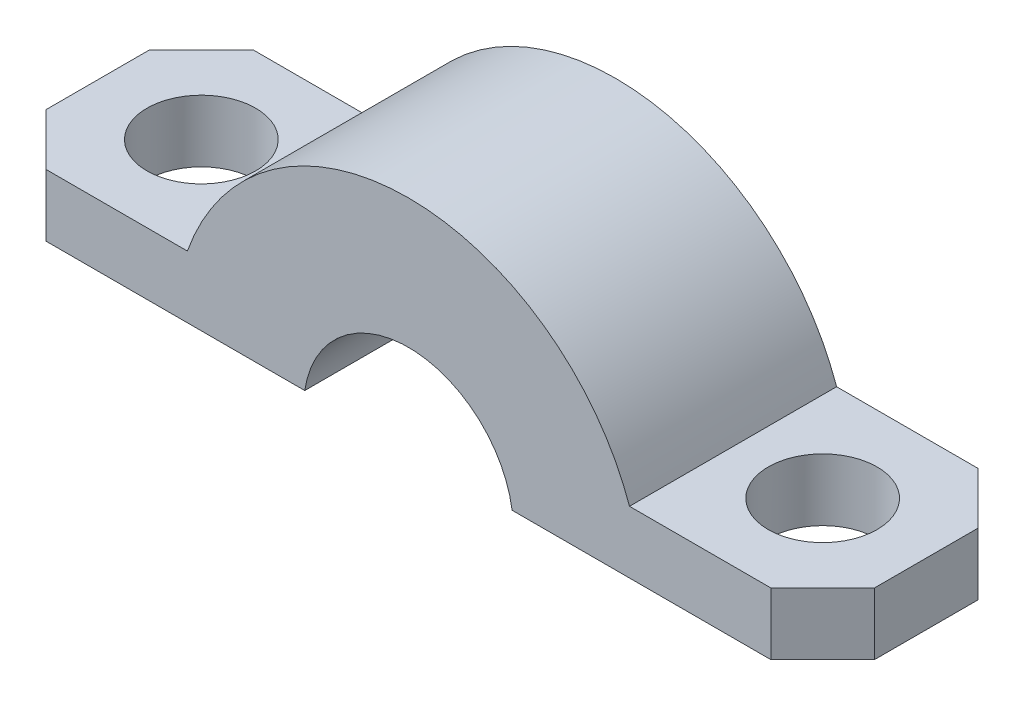
ISO-10303-21;
HEADER;
FILE_DESCRIPTION(('STEP AP214'),'2;1');
FILE_NAME('part.step','',(''),(''),'','','');
FILE_SCHEMA(('AUTOMOTIVE_DESIGN { 1 0 10303 214 1 1 1 1 }'));
ENDSEC;
DATA;
#1=APPLICATION_CONTEXT('core data for automotive mechanical design processes');
#2=APPLICATION_PROTOCOL_DEFINITION('international standard','automotive_design',2000,#1);
#3=PRODUCT_CONTEXT('',#1,'mechanical');
#4=PRODUCT('Part','Part','',(#3));
#5=PRODUCT_RELATED_PRODUCT_CATEGORY('part','',(#4));
#6=PRODUCT_DEFINITION_FORMATION('','',#4);
#7=PRODUCT_DEFINITION_CONTEXT('part definition',#1,'design');
#8=PRODUCT_DEFINITION('design','',#6,#7);
#9=PRODUCT_DEFINITION_SHAPE('','',#8);
#10=(LENGTH_UNIT() NAMED_UNIT(*) SI_UNIT(.MILLI.,.METRE.));
#11=(NAMED_UNIT(*) PLANE_ANGLE_UNIT() SI_UNIT($,.RADIAN.));
#12=(NAMED_UNIT(*) SI_UNIT($,.STERADIAN.) SOLID_ANGLE_UNIT());
#13=UNCERTAINTY_MEASURE_WITH_UNIT(LENGTH_MEASURE(1.E-05),#10,'distance_accuracy_value','');
#14=(GEOMETRIC_REPRESENTATION_CONTEXT(3) GLOBAL_UNCERTAINTY_ASSIGNED_CONTEXT((#13)) GLOBAL_UNIT_ASSIGNED_CONTEXT((#10,
#11,#12)) REPRESENTATION_CONTEXT('',''));
#15=CARTESIAN_POINT('',(0.,0.,0.));
#16=DIRECTION('',(0.,0.,1.));
#17=DIRECTION('',(1.,0.,0.));
#18=AXIS2_PLACEMENT_3D('',#15,#16,#17);
#19=CARTESIAN_POINT('',(0.,0.,4.));
#20=DIRECTION('',(0.,0.,-1.));
#21=DIRECTION('',(-1.,0.,0.));
#22=AXIS2_PLACEMENT_3D('',#19,#20,#21);
#23=CYLINDRICAL_SURFACE('',#22,4.05);
#24=CARTESIAN_POINT('',(0.,0.,-4.));
#25=DIRECTION('',(0.,0.,-1.));
#26=DIRECTION('',(-1.,0.,0.));
#27=AXIS2_PLACEMENT_3D('',#24,#25,#26);
#28=CIRCLE('',#27,4.05);
#29=CARTESIAN_POINT('',(-4.00530897684561,0.6,-4.));
#30=VERTEX_POINT('',#29);
#31=CARTESIAN_POINT('',(4.00530897684561,0.6,-4.));
#32=VERTEX_POINT('',#31);
#33=EDGE_CURVE('E160',#30,#32,#28,.T.);
#34=ORIENTED_EDGE('',*,*,#33,.T.);
#35=DIRECTION('',(0.,0.,-1.));
#36=VECTOR('',#35,1.);
#37=CARTESIAN_POINT('',(4.00530897684561,0.6,4.));
#38=LINE('',#37,#36);
#39=CARTESIAN_POINT('',(4.00530897684561,0.6,4.));
#40=VERTEX_POINT('',#39);
#41=EDGE_CURVE('E141',#32,#40,#38,.F.);
#42=ORIENTED_EDGE('',*,*,#41,.T.);
#43=CARTESIAN_POINT('',(0.,0.,4.));
#44=DIRECTION('',(0.,0.,-1.));
#45=DIRECTION('',(-1.,0.,0.));
#46=AXIS2_PLACEMENT_3D('',#43,#44,#45);
#47=CIRCLE('',#46,4.05);
#48=CARTESIAN_POINT('',(-4.00530897684561,0.6,4.));
#49=VERTEX_POINT('',#48);
#50=EDGE_CURVE('E158',#49,#40,#47,.T.);
#51=ORIENTED_EDGE('',*,*,#50,.F.);
#52=DIRECTION('',(0.,0.,-1.));
#53=VECTOR('',#52,1.);
#54=CARTESIAN_POINT('',(-4.00530897684561,0.6,4.));
#55=LINE('',#54,#53);
#56=EDGE_CURVE('E275',#49,#30,#55,.T.);
#57=ORIENTED_EDGE('',*,*,#56,.T.);
#58=EDGE_LOOP('',(#34,#42,#51,#57));
#59=FACE_BOUND('',#58,.T.);
#60=ADVANCED_FACE('F47',(#59),#23,.F.);
#61=CARTESIAN_POINT('',(16.,3.,4.));
#62=DIRECTION('',(-1.,0.,0.));
#63=DIRECTION('',(0.,0.,1.));
#64=AXIS2_PLACEMENT_3D('',#61,#62,#63);
#65=PLANE('',#64);
#66=DIRECTION('',(0.,0.,-1.));
#67=VECTOR('',#66,1.);
#68=CARTESIAN_POINT('',(16.,0.6,4.));
#69=LINE('',#68,#67);
#70=CARTESIAN_POINT('',(16.,0.6,1.99999999999999));
#71=VERTEX_POINT('',#70);
#72=CARTESIAN_POINT('',(16.,0.6,-2.));
#73=VERTEX_POINT('',#72);
#74=EDGE_CURVE('E162',#71,#73,#69,.T.);
#75=ORIENTED_EDGE('',*,*,#74,.T.);
#76=DIRECTION('',(0.,1.,0.));
#77=VECTOR('',#76,1.);
#78=CARTESIAN_POINT('',(16.,3.,-2.));
#79=LINE('',#78,#77);
#80=CARTESIAN_POINT('',(16.,3.,-2.));
#81=VERTEX_POINT('',#80);
#82=EDGE_CURVE('E222',#73,#81,#79,.T.);
#83=ORIENTED_EDGE('',*,*,#82,.T.);
#84=DIRECTION('',(0.,0.,-1.));
#85=VECTOR('',#84,1.);
#86=CARTESIAN_POINT('',(16.,3.,4.));
#87=LINE('',#86,#85);
#88=CARTESIAN_POINT('',(16.,3.,1.99999999999999));
#89=VERTEX_POINT('',#88);
#90=EDGE_CURVE('E207',#89,#81,#87,.T.);
#91=ORIENTED_EDGE('',*,*,#90,.F.);
#92=DIRECTION('',(0.,-1.,0.));
#93=VECTOR('',#92,1.);
#94=CARTESIAN_POINT('',(16.,3.,1.99999999999999));
#95=LINE('',#94,#93);
#96=EDGE_CURVE('E211',#89,#71,#95,.T.);
#97=ORIENTED_EDGE('',*,*,#96,.T.);
#98=EDGE_LOOP('',(#75,#83,#91,#97));
#99=FACE_BOUND('',#98,.T.);
#100=ADVANCED_FACE('F315',(#99),#65,.F.);
#101=CARTESIAN_POINT('',(8.53829608294301,3.,4.));
#102=DIRECTION('',(0.,-1.,0.));
#103=DIRECTION('',(1.,0.,0.));
#104=AXIS2_PLACEMENT_3D('',#101,#102,#103);
#105=PLANE('',#104);
#106=CARTESIAN_POINT('',(12.,3.,0.));
#107=DIRECTION('',(0.,-1.,0.));
#108=DIRECTION('',(1.,0.,0.));
#109=AXIS2_PLACEMENT_3D('',#106,#107,#108);
#110=CIRCLE('',#109,2.1);
#111=CARTESIAN_POINT('',(14.1,3.,0.));
#112=VERTEX_POINT('',#111);
#113=EDGE_CURVE('E192',#112,#112,#110,.F.);
#114=ORIENTED_EDGE('',*,*,#113,.F.);
#115=EDGE_LOOP('',(#114));
#116=FACE_BOUND('',#115,.T.);
#117=ORIENTED_EDGE('',*,*,#90,.T.);
#118=DIRECTION('',(-0.707106781186549,0.,-0.707106781186547));
#119=VECTOR('',#118,1.);
#120=CARTESIAN_POINT('',(16.,3.,-2.));
#121=LINE('',#120,#119);
#122=CARTESIAN_POINT('',(14.,3.,-4.));
#123=VERTEX_POINT('',#122);
#124=EDGE_CURVE('E229',#81,#123,#121,.T.);
#125=ORIENTED_EDGE('',*,*,#124,.T.);
#126=DIRECTION('',(-1.,0.,0.));
#127=VECTOR('',#126,1.);
#128=CARTESIAN_POINT('',(8.53829608294301,3.,-4.));
#129=LINE('',#128,#127);
#130=CARTESIAN_POINT('',(8.53829608294301,3.,-4.));
#131=VERTEX_POINT('',#130);
#132=EDGE_CURVE('E191',#123,#131,#129,.T.);
#133=ORIENTED_EDGE('',*,*,#132,.T.);
#134=DIRECTION('',(0.,0.,-1.));
#135=VECTOR('',#134,1.);
#136=CARTESIAN_POINT('',(8.53829608294301,3.,4.));
#137=LINE('',#136,#135);
#138=CARTESIAN_POINT('',(8.53829608294301,3.,4.));
#139=VERTEX_POINT('',#138);
#140=EDGE_CURVE('E203',#139,#131,#137,.T.);
#141=ORIENTED_EDGE('',*,*,#140,.F.);
#142=DIRECTION('',(-1.,0.,0.));
#143=VECTOR('',#142,1.);
#144=CARTESIAN_POINT('',(8.53829608294301,3.,4.));
#145=LINE('',#144,#143);
#146=CARTESIAN_POINT('',(14.,3.,4.));
#147=VERTEX_POINT('',#146);
#148=EDGE_CURVE('E169',#147,#139,#145,.T.);
#149=ORIENTED_EDGE('',*,*,#148,.F.);
#150=DIRECTION('',(-0.707106781186546,0.,0.707106781186549));
#151=VECTOR('',#150,1.);
#152=CARTESIAN_POINT('',(14.,3.,4.));
#153=LINE('',#152,#151);
#154=EDGE_CURVE('E226',#147,#89,#153,.F.);
#155=ORIENTED_EDGE('',*,*,#154,.T.);
#156=EDGE_LOOP('',(#117,#125,#133,#141,#149,#155));
#157=FACE_BOUND('',#156,.T.);
#158=ADVANCED_FACE('F311',(#116,#157),#105,.F.);
#159=CARTESIAN_POINT('',(0.,0.,4.));
#160=DIRECTION('',(0.,0.,-1.));
#161=DIRECTION('',(-1.,0.,0.));
#162=AXIS2_PLACEMENT_3D('',#159,#160,#161);
#163=CYLINDRICAL_SURFACE('',#162,9.05);
#164=CARTESIAN_POINT('',(0.,0.,-4.));
#165=DIRECTION('',(0.,0.,1.));
#166=DIRECTION('',(-1.,0.,0.));
#167=AXIS2_PLACEMENT_3D('',#164,#165,#166);
#168=CIRCLE('',#167,9.05);
#169=CARTESIAN_POINT('',(-8.53829608294301,3.,-4.));
#170=VERTEX_POINT('',#169);
#171=EDGE_CURVE('E176',#131,#170,#168,.T.);
#172=ORIENTED_EDGE('',*,*,#171,.T.);
#173=DIRECTION('',(0.,0.,-1.));
#174=VECTOR('',#173,1.);
#175=CARTESIAN_POINT('',(-8.53829608294301,3.,4.));
#176=LINE('',#175,#174);
#177=CARTESIAN_POINT('',(-8.53829608294301,3.,4.));
#178=VERTEX_POINT('',#177);
#179=EDGE_CURVE('E199',#178,#170,#176,.T.);
#180=ORIENTED_EDGE('',*,*,#179,.F.);
#181=CARTESIAN_POINT('',(0.,0.,4.));
#182=DIRECTION('',(0.,0.,1.));
#183=DIRECTION('',(-1.,0.,0.));
#184=AXIS2_PLACEMENT_3D('',#181,#182,#183);
#185=CIRCLE('',#184,9.05);
#186=EDGE_CURVE('E174',#139,#178,#185,.T.);
#187=ORIENTED_EDGE('',*,*,#186,.F.);
#188=ORIENTED_EDGE('',*,*,#140,.T.);
#189=EDGE_LOOP('',(#172,#180,#187,#188));
#190=FACE_BOUND('',#189,.T.);
#191=ADVANCED_FACE('F303',(#190),#163,.T.);
#192=CARTESIAN_POINT('',(-16.,3.,4.));
#193=DIRECTION('',(0.,-1.,0.));
#194=DIRECTION('',(1.,0.,0.));
#195=AXIS2_PLACEMENT_3D('',#192,#193,#194);
#196=PLANE('',#195);
#197=CARTESIAN_POINT('',(-12.,3.,0.));
#198=DIRECTION('',(0.,-1.,0.));
#199=DIRECTION('',(1.,0.,0.));
#200=AXIS2_PLACEMENT_3D('',#197,#198,#199);
#201=CIRCLE('',#200,2.1);
#202=CARTESIAN_POINT('',(-9.9,3.,0.));
#203=VERTEX_POINT('',#202);
#204=EDGE_CURVE('E179',#203,#203,#201,.F.);
#205=ORIENTED_EDGE('',*,*,#204,.F.);
#206=EDGE_LOOP('',(#205));
#207=FACE_BOUND('',#206,.T.);
#208=DIRECTION('',(-1.,0.,0.));
#209=VECTOR('',#208,1.);
#210=CARTESIAN_POINT('',(-16.,3.,-4.));
#211=LINE('',#210,#209);
#212=CARTESIAN_POINT('',(-14.,3.,-4.));
#213=VERTEX_POINT('',#212);
#214=EDGE_CURVE('E170',#170,#213,#211,.T.);
#215=ORIENTED_EDGE('',*,*,#214,.T.);
#216=DIRECTION('',(-0.707106781186549,0.,0.707106781186547));
#217=VECTOR('',#216,1.);
#218=CARTESIAN_POINT('',(-16.,3.,-2.));
#219=LINE('',#218,#217);
#220=CARTESIAN_POINT('',(-16.,3.,-2.));
#221=VERTEX_POINT('',#220);
#222=EDGE_CURVE('E11',#213,#221,#219,.T.);
#223=ORIENTED_EDGE('',*,*,#222,.T.);
#224=DIRECTION('',(0.,0.,-1.));
#225=VECTOR('',#224,1.);
#226=CARTESIAN_POINT('',(-16.,3.,4.));
#227=LINE('',#226,#225);
#228=CARTESIAN_POINT('',(-16.,3.,1.99999999999999));
#229=VERTEX_POINT('',#228);
#230=EDGE_CURVE('E188',#229,#221,#227,.T.);
#231=ORIENTED_EDGE('',*,*,#230,.F.);
#232=DIRECTION('',(-0.707106781186546,0.,-0.707106781186549));
#233=VECTOR('',#232,1.);
#234=CARTESIAN_POINT('',(-14.,3.,4.));
#235=LINE('',#234,#233);
#236=CARTESIAN_POINT('',(-14.,3.,4.));
#237=VERTEX_POINT('',#236);
#238=EDGE_CURVE('E57',#229,#237,#235,.F.);
#239=ORIENTED_EDGE('',*,*,#238,.T.);
#240=DIRECTION('',(-1.,0.,0.));
#241=VECTOR('',#240,1.);
#242=CARTESIAN_POINT('',(-16.,3.,4.));
#243=LINE('',#242,#241);
#244=EDGE_CURVE('E184',#178,#237,#243,.T.);
#245=ORIENTED_EDGE('',*,*,#244,.F.);
#246=ORIENTED_EDGE('',*,*,#179,.T.);
#247=EDGE_LOOP('',(#215,#223,#231,#239,#245,#246));
#248=FACE_BOUND('',#247,.T.);
#249=ADVANCED_FACE('F263',(#207,#248),#196,.F.);
#250=CARTESIAN_POINT('',(-16.,0.,4.));
#251=DIRECTION('',(1.,0.,0.));
#252=DIRECTION('',(0.,0.,-1.));
#253=AXIS2_PLACEMENT_3D('',#250,#251,#252);
#254=PLANE('',#253);
#255=ORIENTED_EDGE('',*,*,#230,.T.);
#256=DIRECTION('',(0.,-1.,0.));
#257=VECTOR('',#256,1.);
#258=CARTESIAN_POINT('',(-16.,0.6,-2.));
#259=LINE('',#258,#257);
#260=CARTESIAN_POINT('',(-16.,0.6,-2.));
#261=VERTEX_POINT('',#260);
#262=EDGE_CURVE('E251',#221,#261,#259,.T.);
#263=ORIENTED_EDGE('',*,*,#262,.T.);
#264=DIRECTION('',(0.,0.,1.));
#265=VECTOR('',#264,1.);
#266=CARTESIAN_POINT('',(-16.,0.6,4.));
#267=LINE('',#266,#265);
#268=CARTESIAN_POINT('',(-16.,0.6,1.99999999999999));
#269=VERTEX_POINT('',#268);
#270=EDGE_CURVE('E271',#261,#269,#267,.T.);
#271=ORIENTED_EDGE('',*,*,#270,.T.);
#272=DIRECTION('',(0.,1.,0.));
#273=VECTOR('',#272,1.);
#274=CARTESIAN_POINT('',(-16.,0.,1.99999999999999));
#275=LINE('',#274,#273);
#276=EDGE_CURVE('E69',#269,#229,#275,.T.);
#277=ORIENTED_EDGE('',*,*,#276,.T.);
#278=EDGE_LOOP('',(#255,#263,#271,#277));
#279=FACE_BOUND('',#278,.T.);
#280=ADVANCED_FACE('F272',(#279),#254,.F.);
#281=CARTESIAN_POINT('',(0.,0.,4.));
#282=DIRECTION('',(0.,0.,-1.));
#283=DIRECTION('',(-1.,0.,0.));
#284=AXIS2_PLACEMENT_3D('',#281,#282,#283);
#285=PLANE('',#284);
#286=DIRECTION('',(1.,0.,0.));
#287=VECTOR('',#286,1.);
#288=CARTESIAN_POINT('',(0.,0.6,4.));
#289=LINE('',#288,#287);
#290=CARTESIAN_POINT('',(14.,0.6,4.));
#291=VERTEX_POINT('',#290);
#292=EDGE_CURVE('E137',#40,#291,#289,.T.);
#293=ORIENTED_EDGE('',*,*,#292,.T.);
#294=DIRECTION('',(0.,1.,0.));
#295=VECTOR('',#294,1.);
#296=CARTESIAN_POINT('',(14.,0.,4.));
#297=LINE('',#296,#295);
#298=EDGE_CURVE('E246',#291,#147,#297,.T.);
#299=ORIENTED_EDGE('',*,*,#298,.T.);
#300=ORIENTED_EDGE('',*,*,#148,.T.);
#301=ORIENTED_EDGE('',*,*,#186,.T.);
#302=ORIENTED_EDGE('',*,*,#244,.T.);
#303=DIRECTION('',(0.,-1.,0.));
#304=VECTOR('',#303,1.);
#305=CARTESIAN_POINT('',(-14.,0.,4.));
#306=LINE('',#305,#304);
#307=CARTESIAN_POINT('',(-14.,0.6,4.));
#308=VERTEX_POINT('',#307);
#309=EDGE_CURVE('E243',#237,#308,#306,.T.);
#310=ORIENTED_EDGE('',*,*,#309,.T.);
#311=EDGE_CURVE('E153',#308,#49,#289,.T.);
#312=ORIENTED_EDGE('',*,*,#311,.T.);
#313=ORIENTED_EDGE('',*,*,#50,.T.);
#314=EDGE_LOOP('',(#293,#299,#300,#301,#302,#310,#312,#313));
#315=FACE_BOUND('',#314,.T.);
#316=ADVANCED_FACE('F164',(#315),#285,.F.);
#317=CARTESIAN_POINT('',(0.,0.,-4.));
#318=DIRECTION('',(0.,0.,-1.));
#319=DIRECTION('',(-1.,0.,0.));
#320=AXIS2_PLACEMENT_3D('',#317,#318,#319);
#321=PLANE('',#320);
#322=ORIENTED_EDGE('',*,*,#132,.F.);
#323=DIRECTION('',(0.,-1.,0.));
#324=VECTOR('',#323,1.);
#325=CARTESIAN_POINT('',(14.,0.6,-4.));
#326=LINE('',#325,#324);
#327=CARTESIAN_POINT('',(14.,0.6,-4.));
#328=VERTEX_POINT('',#327);
#329=EDGE_CURVE('E235',#123,#328,#326,.T.);
#330=ORIENTED_EDGE('',*,*,#329,.T.);
#331=DIRECTION('',(1.,0.,0.));
#332=VECTOR('',#331,1.);
#333=CARTESIAN_POINT('',(0.,0.6,-4.));
#334=LINE('',#333,#332);
#335=EDGE_CURVE('E280',#32,#328,#334,.T.);
#336=ORIENTED_EDGE('',*,*,#335,.F.);
#337=ORIENTED_EDGE('',*,*,#33,.F.);
#338=CARTESIAN_POINT('',(-14.,0.6,-4.));
#339=VERTEX_POINT('',#338);
#340=EDGE_CURVE('E151',#339,#30,#334,.T.);
#341=ORIENTED_EDGE('',*,*,#340,.F.);
#342=DIRECTION('',(0.,1.,0.));
#343=VECTOR('',#342,1.);
#344=CARTESIAN_POINT('',(-14.,3.,-4.));
#345=LINE('',#344,#343);
#346=EDGE_CURVE('E232',#339,#213,#345,.T.);
#347=ORIENTED_EDGE('',*,*,#346,.T.);
#348=ORIENTED_EDGE('',*,*,#214,.F.);
#349=ORIENTED_EDGE('',*,*,#171,.F.);
#350=EDGE_LOOP('',(#322,#330,#336,#337,#341,#347,#348,#349));
#351=FACE_BOUND('',#350,.T.);
#352=ADVANCED_FACE('F295',(#351),#321,.T.);
#353=CARTESIAN_POINT('',(-12.,9.05,0.));
#354=DIRECTION('',(0.,-1.,0.));
#355=DIRECTION('',(0.,0.,-1.));
#356=AXIS2_PLACEMENT_3D('',#353,#354,#355);
#357=CYLINDRICAL_SURFACE('',#356,2.1);
#358=CARTESIAN_POINT('',(-12.,0.6,0.));
#359=DIRECTION('',(0.,1.,0.));
#360=DIRECTION('',(0.,0.,1.));
#361=AXIS2_PLACEMENT_3D('',#358,#359,#360);
#362=CIRCLE('',#361,2.1);
#363=CARTESIAN_POINT('',(-12.,0.6,2.1));
#364=VERTEX_POINT('',#363);
#365=EDGE_CURVE('E219',#364,#364,#362,.T.);
#366=ORIENTED_EDGE('',*,*,#365,.F.);
#367=EDGE_LOOP('',(#366));
#368=FACE_BOUND('',#367,.T.);
#369=ORIENTED_EDGE('',*,*,#204,.T.);
#370=EDGE_LOOP('',(#369));
#371=FACE_BOUND('',#370,.T.);
#372=ADVANCED_FACE('F291',(#368,#371),#357,.F.);
#373=CARTESIAN_POINT('',(12.,9.05,0.));
#374=DIRECTION('',(0.,-1.,0.));
#375=DIRECTION('',(0.,0.,-1.));
#376=AXIS2_PLACEMENT_3D('',#373,#374,#375);
#377=CYLINDRICAL_SURFACE('',#376,2.1);
#378=CARTESIAN_POINT('',(12.,0.6,0.));
#379=DIRECTION('',(0.,1.,0.));
#380=DIRECTION('',(0.,0.,1.));
#381=AXIS2_PLACEMENT_3D('',#378,#379,#380);
#382=CIRCLE('',#381,2.1);
#383=CARTESIAN_POINT('',(12.,0.6,2.1));
#384=VERTEX_POINT('',#383);
#385=EDGE_CURVE('E215',#384,#384,#382,.T.);
#386=ORIENTED_EDGE('',*,*,#385,.F.);
#387=EDGE_LOOP('',(#386));
#388=FACE_BOUND('',#387,.T.);
#389=ORIENTED_EDGE('',*,*,#113,.T.);
#390=EDGE_LOOP('',(#389));
#391=FACE_BOUND('',#390,.T.);
#392=ADVANCED_FACE('F294',(#388,#391),#377,.F.);
#393=CARTESIAN_POINT('',(0.,0.6,0.));
#394=DIRECTION('',(0.,1.,0.));
#395=DIRECTION('',(0.,0.,1.));
#396=AXIS2_PLACEMENT_3D('',#393,#394,#395);
#397=PLANE('',#396);
#398=ORIENTED_EDGE('',*,*,#385,.T.);
#399=EDGE_LOOP('',(#398));
#400=FACE_BOUND('',#399,.T.);
#401=ORIENTED_EDGE('',*,*,#335,.T.);
#402=DIRECTION('',(0.707106781186549,0.,0.707106781186547));
#403=VECTOR('',#402,1.);
#404=CARTESIAN_POINT('',(16.,0.6,-2.));
#405=LINE('',#404,#403);
#406=EDGE_CURVE('E240',#328,#73,#405,.T.);
#407=ORIENTED_EDGE('',*,*,#406,.T.);
#408=ORIENTED_EDGE('',*,*,#74,.F.);
#409=DIRECTION('',(0.707106781186546,0.,-0.707106781186549));
#410=VECTOR('',#409,1.);
#411=CARTESIAN_POINT('',(14.,0.6,4.));
#412=LINE('',#411,#410);
#413=EDGE_CURVE('E145',#71,#291,#412,.F.);
#414=ORIENTED_EDGE('',*,*,#413,.T.);
#415=ORIENTED_EDGE('',*,*,#292,.F.);
#416=ORIENTED_EDGE('',*,*,#41,.F.);
#417=EDGE_LOOP('',(#401,#407,#408,#414,#415,#416));
#418=FACE_BOUND('',#417,.T.);
#419=ADVANCED_FACE('F140',(#400,#418),#397,.F.);
#420=ORIENTED_EDGE('',*,*,#365,.T.);
#421=EDGE_LOOP('',(#420));
#422=FACE_BOUND('',#421,.T.);
#423=ORIENTED_EDGE('',*,*,#270,.F.);
#424=DIRECTION('',(0.707106781186549,0.,-0.707106781186547));
#425=VECTOR('',#424,1.);
#426=CARTESIAN_POINT('',(-16.,0.6,-2.));
#427=LINE('',#426,#425);
#428=EDGE_CURVE('E258',#261,#339,#427,.T.);
#429=ORIENTED_EDGE('',*,*,#428,.T.);
#430=ORIENTED_EDGE('',*,*,#340,.T.);
#431=ORIENTED_EDGE('',*,*,#56,.F.);
#432=ORIENTED_EDGE('',*,*,#311,.F.);
#433=DIRECTION('',(0.707106781186546,0.,0.707106781186549));
#434=VECTOR('',#433,1.);
#435=CARTESIAN_POINT('',(-14.,0.6,4.));
#436=LINE('',#435,#434);
#437=EDGE_CURVE('E255',#308,#269,#436,.F.);
#438=ORIENTED_EDGE('',*,*,#437,.T.);
#439=EDGE_LOOP('',(#423,#429,#430,#431,#432,#438));
#440=FACE_BOUND('',#439,.T.);
#441=ADVANCED_FACE('F270',(#422,#440),#397,.F.);
#442=CARTESIAN_POINT('',(16.,3.,-2.));
#443=DIRECTION('',(0.707106781186547,0.,-0.707106781186549));
#444=DIRECTION('',(0.,-1.,0.));
#445=AXIS2_PLACEMENT_3D('',#442,#443,#444);
#446=PLANE('',#445);
#447=ORIENTED_EDGE('',*,*,#406,.F.);
#448=ORIENTED_EDGE('',*,*,#329,.F.);
#449=ORIENTED_EDGE('',*,*,#124,.F.);
#450=ORIENTED_EDGE('',*,*,#82,.F.);
#451=EDGE_LOOP('',(#447,#448,#449,#450));
#452=FACE_BOUND('',#451,.T.);
#453=ADVANCED_FACE('F325',(#452),#446,.T.);
#454=CARTESIAN_POINT('',(14.,0.,4.));
#455=DIRECTION('',(-0.707106781186549,0.,-0.707106781186546));
#456=DIRECTION('',(0.,1.,0.));
#457=AXIS2_PLACEMENT_3D('',#454,#455,#456);
#458=PLANE('',#457);
#459=ORIENTED_EDGE('',*,*,#413,.F.);
#460=ORIENTED_EDGE('',*,*,#96,.F.);
#461=ORIENTED_EDGE('',*,*,#154,.F.);
#462=ORIENTED_EDGE('',*,*,#298,.F.);
#463=EDGE_LOOP('',(#459,#460,#461,#462));
#464=FACE_BOUND('',#463,.T.);
#465=ADVANCED_FACE('F331',(#464),#458,.F.);
#466=CARTESIAN_POINT('',(-16.,0.,-2.));
#467=DIRECTION('',(-0.707106781186547,0.,-0.707106781186549));
#468=DIRECTION('',(0.,1.,0.));
#469=AXIS2_PLACEMENT_3D('',#466,#467,#468);
#470=PLANE('',#469);
#471=ORIENTED_EDGE('',*,*,#222,.F.);
#472=ORIENTED_EDGE('',*,*,#346,.F.);
#473=ORIENTED_EDGE('',*,*,#428,.F.);
#474=ORIENTED_EDGE('',*,*,#262,.F.);
#475=EDGE_LOOP('',(#471,#472,#473,#474));
#476=FACE_BOUND('',#475,.T.);
#477=ADVANCED_FACE('F337',(#476),#470,.T.);
#478=CARTESIAN_POINT('',(-14.,0.,4.));
#479=DIRECTION('',(0.707106781186549,0.,-0.707106781186546));
#480=DIRECTION('',(0.,-1.,0.));
#481=AXIS2_PLACEMENT_3D('',#478,#479,#480);
#482=PLANE('',#481);
#483=ORIENTED_EDGE('',*,*,#238,.F.);
#484=ORIENTED_EDGE('',*,*,#276,.F.);
#485=ORIENTED_EDGE('',*,*,#437,.F.);
#486=ORIENTED_EDGE('',*,*,#309,.F.);
#487=EDGE_LOOP('',(#483,#484,#485,#486));
#488=FACE_BOUND('',#487,.T.);
#489=ADVANCED_FACE('F50',(#488),#482,.F.);
#490=CLOSED_SHELL('',(#60,#100,#158,#191,#249,#280,#316,#352,#372,#392,#419,#441,#453,#465,#477,#489));
#491=MANIFOLD_SOLID_BREP('B2',#490);
#492=ADVANCED_BREP_SHAPE_REPRESENTATION('',(#18,#491),#14);
#493=SHAPE_DEFINITION_REPRESENTATION(#9,#492);
ENDSEC;
END-ISO-10303-21;
